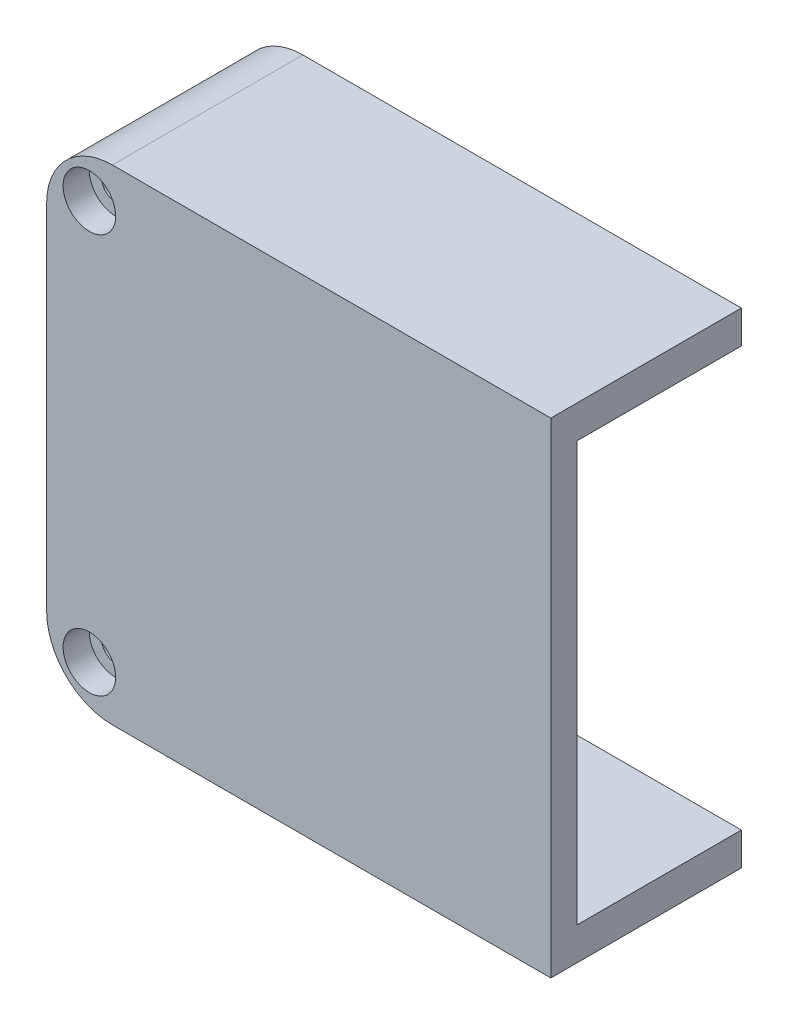
ISO-10303-21;
HEADER;
FILE_DESCRIPTION(('STEP AP214'),'2;1');
FILE_NAME('part.step','',(''),(''),'','','');
FILE_SCHEMA(('AUTOMOTIVE_DESIGN { 1 0 10303 214 1 1 1 1 }'));
ENDSEC;
DATA;
#1=APPLICATION_CONTEXT('core data for automotive mechanical design processes');
#2=APPLICATION_PROTOCOL_DEFINITION('international standard','automotive_design',2000,#1);
#3=PRODUCT_CONTEXT('',#1,'mechanical');
#4=PRODUCT('Part','Part','',(#3));
#5=PRODUCT_RELATED_PRODUCT_CATEGORY('part','',(#4));
#6=PRODUCT_DEFINITION_FORMATION('','',#4);
#7=PRODUCT_DEFINITION_CONTEXT('part definition',#1,'design');
#8=PRODUCT_DEFINITION('design','',#6,#7);
#9=PRODUCT_DEFINITION_SHAPE('','',#8);
#10=(LENGTH_UNIT() NAMED_UNIT(*) SI_UNIT(.MILLI.,.METRE.));
#11=(NAMED_UNIT(*) PLANE_ANGLE_UNIT() SI_UNIT($,.RADIAN.));
#12=(NAMED_UNIT(*) SI_UNIT($,.STERADIAN.) SOLID_ANGLE_UNIT());
#13=UNCERTAINTY_MEASURE_WITH_UNIT(LENGTH_MEASURE(1.E-05),#10,'distance_accuracy_value','');
#14=(GEOMETRIC_REPRESENTATION_CONTEXT(3) GLOBAL_UNCERTAINTY_ASSIGNED_CONTEXT((#13)) GLOBAL_UNIT_ASSIGNED_CONTEXT((#10,
#11,#12)) REPRESENTATION_CONTEXT('',''));
#15=CARTESIAN_POINT('',(0.,0.,0.));
#16=DIRECTION('',(0.,0.,1.));
#17=DIRECTION('',(1.,0.,0.));
#18=AXIS2_PLACEMENT_3D('',#15,#16,#17);
#19=CARTESIAN_POINT('',(-76.7346028544592,-29.9472521696102,25.));
#20=DIRECTION('',(-1.,0.,0.));
#21=DIRECTION('',(0.,0.,1.));
#22=AXIS2_PLACEMENT_3D('',#19,#20,#21);
#23=PLANE('',#22);
#24=DIRECTION('',(0.,1.,0.));
#25=VECTOR('',#24,1.);
#26=CARTESIAN_POINT('',(-76.7346028544592,-29.9472521696102,25.));
#27=LINE('',#26,#25);
#28=CARTESIAN_POINT('',(-76.7346028544592,-19.3909029835062,25.));
#29=VERTEX_POINT('',#28);
#30=CARTESIAN_POINT('',(-76.7346028544592,23.2934401466912,25.));
#31=VERTEX_POINT('',#30);
#32=EDGE_CURVE('E191',#29,#31,#27,.T.);
#33=ORIENTED_EDGE('',*,*,#32,.F.);
#34=DIRECTION('',(0.,0.,-1.));
#35=VECTOR('',#34,1.);
#36=CARTESIAN_POINT('',(-76.7346028544592,-19.3909029835062,0.));
#37=LINE('',#36,#35);
#38=CARTESIAN_POINT('',(-76.7346028544592,-19.3909029835062,0.));
#39=VERTEX_POINT('',#38);
#40=EDGE_CURVE('E211',#29,#39,#37,.T.);
#41=ORIENTED_EDGE('',*,*,#40,.T.);
#42=DIRECTION('',(0.,1.,0.));
#43=VECTOR('',#42,1.);
#44=CARTESIAN_POINT('',(-76.7346028544592,-29.9472521696102,0.));
#45=LINE('',#44,#43);
#46=CARTESIAN_POINT('',(-76.7346028544592,23.2934401466912,0.));
#47=VERTEX_POINT('',#46);
#48=EDGE_CURVE('E198',#39,#47,#45,.T.);
#49=ORIENTED_EDGE('',*,*,#48,.T.);
#50=DIRECTION('',(0.,0.,-1.));
#51=VECTOR('',#50,1.);
#52=CARTESIAN_POINT('',(-76.7346028544592,23.2934401466912,25.));
#53=LINE('',#52,#51);
#54=EDGE_CURVE('E209',#47,#31,#53,.F.);
#55=ORIENTED_EDGE('',*,*,#54,.T.);
#56=EDGE_LOOP('',(#33,#41,#49,#55));
#57=FACE_BOUND('',#56,.T.);
#58=ADVANCED_FACE('F33',(#57),#23,.F.);
#59=CARTESIAN_POINT('',(-76.7346028544592,-29.9472521696102,25.));
#60=DIRECTION('',(0.,-1.,0.));
#61=DIRECTION('',(0.,0.,-1.));
#62=AXIS2_PLACEMENT_3D('',#59,#60,#61);
#63=PLANE('',#62);
#64=DIRECTION('',(-1.,0.,0.));
#65=VECTOR('',#64,1.);
#66=CARTESIAN_POINT('',(-76.7346028544592,-29.9472521696102,0.));
#67=LINE('',#66,#65);
#68=CARTESIAN_POINT('',(-5.00749779782367,-29.9472521696102,0.));
#69=VERTEX_POINT('',#68);
#70=CARTESIAN_POINT('',(-66.1782536683552,-29.9472521696102,0.));
#71=VERTEX_POINT('',#70);
#72=EDGE_CURVE('E317',#69,#71,#67,.T.);
#73=ORIENTED_EDGE('',*,*,#72,.T.);
#74=DIRECTION('',(0.,0.,-1.));
#75=VECTOR('',#74,1.);
#76=CARTESIAN_POINT('',(-66.1782536683552,-29.9472521696102,25.));
#77=LINE('',#76,#75);
#78=CARTESIAN_POINT('',(-66.1782536683552,-29.9472521696102,25.));
#79=VERTEX_POINT('',#78);
#80=EDGE_CURVE('E199',#71,#79,#77,.F.);
#81=ORIENTED_EDGE('',*,*,#80,.T.);
#82=DIRECTION('',(-1.,0.,0.));
#83=VECTOR('',#82,1.);
#84=CARTESIAN_POINT('',(-76.7346028544592,-29.9472521696102,25.));
#85=LINE('',#84,#83);
#86=CARTESIAN_POINT('',(-5.00749779782367,-29.9472521696102,25.));
#87=VERTEX_POINT('',#86);
#88=EDGE_CURVE('E197',#87,#79,#85,.T.);
#89=ORIENTED_EDGE('',*,*,#88,.F.);
#90=DIRECTION('',(0.,0.,-1.));
#91=VECTOR('',#90,1.);
#92=CARTESIAN_POINT('',(-5.00749779782367,-29.9472521696102,25.));
#93=LINE('',#92,#91);
#94=EDGE_CURVE('E304',#87,#69,#93,.T.);
#95=ORIENTED_EDGE('',*,*,#94,.T.);
#96=EDGE_LOOP('',(#73,#81,#89,#95));
#97=FACE_BOUND('',#96,.T.);
#98=ADVANCED_FACE('F363',(#97),#63,.F.);
#99=CARTESIAN_POINT('',(-76.7346028544592,33.8497893327953,25.));
#100=DIRECTION('',(0.,1.,0.));
#101=DIRECTION('',(0.,0.,1.));
#102=AXIS2_PLACEMENT_3D('',#99,#100,#101);
#103=PLANE('',#102);
#104=DIRECTION('',(1.,0.,0.));
#105=VECTOR('',#104,1.);
#106=CARTESIAN_POINT('',(-76.7346028544592,33.8497893327953,25.));
#107=LINE('',#106,#105);
#108=CARTESIAN_POINT('',(-66.1782536683552,33.8497893327953,25.));
#109=VERTEX_POINT('',#108);
#110=CARTESIAN_POINT('',(-5.00749779782368,33.8497893327953,25.));
#111=VERTEX_POINT('',#110);
#112=EDGE_CURVE('E194',#109,#111,#107,.T.);
#113=ORIENTED_EDGE('',*,*,#112,.F.);
#114=DIRECTION('',(0.,0.,-1.));
#115=VECTOR('',#114,1.);
#116=CARTESIAN_POINT('',(-66.1782536683552,33.8497893327953,0.));
#117=LINE('',#116,#115);
#118=CARTESIAN_POINT('',(-66.1782536683552,33.8497893327953,0.));
#119=VERTEX_POINT('',#118);
#120=EDGE_CURVE('E214',#109,#119,#117,.T.);
#121=ORIENTED_EDGE('',*,*,#120,.T.);
#122=DIRECTION('',(1.,0.,0.));
#123=VECTOR('',#122,1.);
#124=CARTESIAN_POINT('',(-76.7346028544592,33.8497893327953,0.));
#125=LINE('',#124,#123);
#126=CARTESIAN_POINT('',(-5.00749779782367,33.8497893327953,0.));
#127=VERTEX_POINT('',#126);
#128=EDGE_CURVE('E185',#119,#127,#125,.T.);
#129=ORIENTED_EDGE('',*,*,#128,.T.);
#130=DIRECTION('',(0.,0.,-1.));
#131=VECTOR('',#130,1.);
#132=CARTESIAN_POINT('',(-5.00749779782367,33.8497893327953,25.));
#133=LINE('',#132,#131);
#134=EDGE_CURVE('E298',#111,#127,#133,.T.);
#135=ORIENTED_EDGE('',*,*,#134,.F.);
#136=EDGE_LOOP('',(#113,#121,#129,#135));
#137=FACE_BOUND('',#136,.T.);
#138=ADVANCED_FACE('F337',(#137),#103,.F.);
#139=CARTESIAN_POINT('',(-76.7346028544592,38.8497893327953,25.));
#140=DIRECTION('',(0.,1.,0.));
#141=DIRECTION('',(0.,0.,1.));
#142=AXIS2_PLACEMENT_3D('',#139,#140,#141);
#143=PLANE('',#142);
#144=DIRECTION('',(1.,0.,0.));
#145=VECTOR('',#144,1.);
#146=CARTESIAN_POINT('',(-76.7346028544592,38.8497893327953,0.));
#147=LINE('',#146,#145);
#148=CARTESIAN_POINT('',(-71.7346028544593,38.8497893327953,0.));
#149=VERTEX_POINT('',#148);
#150=CARTESIAN_POINT('',(-5.00749779782367,38.8497893327953,0.));
#151=VERTEX_POINT('',#150);
#152=EDGE_CURVE('E329',#149,#151,#147,.T.);
#153=ORIENTED_EDGE('',*,*,#152,.F.);
#154=DIRECTION('',(0.,0.,-1.));
#155=VECTOR('',#154,1.);
#156=CARTESIAN_POINT('',(-71.7346028544593,38.8497893327953,25.));
#157=LINE('',#156,#155);
#158=CARTESIAN_POINT('',(-71.7346028544593,38.8497893327953,29.));
#159=VERTEX_POINT('',#158);
#160=EDGE_CURVE('E278',#149,#159,#157,.F.);
#161=ORIENTED_EDGE('',*,*,#160,.T.);
#162=DIRECTION('',(-1.,0.,0.));
#163=VECTOR('',#162,1.);
#164=CARTESIAN_POINT('',(-81.7346028544592,38.8497893327953,29.));
#165=LINE('',#164,#163);
#166=CARTESIAN_POINT('',(-5.00749779782368,38.8497893327953,29.));
#167=VERTEX_POINT('',#166);
#168=EDGE_CURVE('E250',#167,#159,#165,.T.);
#169=ORIENTED_EDGE('',*,*,#168,.F.);
#170=DIRECTION('',(0.,0.,-1.));
#171=VECTOR('',#170,1.);
#172=CARTESIAN_POINT('',(-5.00749779782367,38.8497893327953,25.));
#173=LINE('',#172,#171);
#174=EDGE_CURVE('E311',#167,#151,#173,.T.);
#175=ORIENTED_EDGE('',*,*,#174,.T.);
#176=EDGE_LOOP('',(#153,#161,#169,#175));
#177=FACE_BOUND('',#176,.T.);
#178=ADVANCED_FACE('F349',(#177),#143,.T.);
#179=CARTESIAN_POINT('',(-81.7346028544592,-29.9472521696102,25.));
#180=DIRECTION('',(-1.,0.,0.));
#181=DIRECTION('',(0.,0.,1.));
#182=AXIS2_PLACEMENT_3D('',#179,#180,#181);
#183=PLANE('',#182);
#184=DIRECTION('',(0.,1.,0.));
#185=VECTOR('',#184,1.);
#186=CARTESIAN_POINT('',(-81.7346028544592,-29.9472521696102,0.));
#187=LINE('',#186,#185);
#188=CARTESIAN_POINT('',(-81.7346028544592,-24.9472521696102,0.));
#189=VERTEX_POINT('',#188);
#190=CARTESIAN_POINT('',(-81.7346028544592,28.8497893327953,0.));
#191=VERTEX_POINT('',#190);
#192=EDGE_CURVE('E326',#189,#191,#187,.T.);
#193=ORIENTED_EDGE('',*,*,#192,.F.);
#194=DIRECTION('',(0.,0.,-1.));
#195=VECTOR('',#194,1.);
#196=CARTESIAN_POINT('',(-81.7346028544592,-24.9472521696102,25.));
#197=LINE('',#196,#195);
#198=CARTESIAN_POINT('',(-81.7346028544592,-24.9472521696102,29.));
#199=VERTEX_POINT('',#198);
#200=EDGE_CURVE('E286',#189,#199,#197,.F.);
#201=ORIENTED_EDGE('',*,*,#200,.T.);
#202=DIRECTION('',(0.,-1.,0.));
#203=VECTOR('',#202,1.);
#204=CARTESIAN_POINT('',(-81.7346028544592,38.8497893327953,29.));
#205=LINE('',#204,#203);
#206=CARTESIAN_POINT('',(-81.7346028544592,28.8497893327953,29.));
#207=VERTEX_POINT('',#206);
#208=EDGE_CURVE('E232',#207,#199,#205,.T.);
#209=ORIENTED_EDGE('',*,*,#208,.F.);
#210=DIRECTION('',(0.,0.,-1.));
#211=VECTOR('',#210,1.);
#212=CARTESIAN_POINT('',(-81.7346028544592,28.8497893327953,25.));
#213=LINE('',#212,#211);
#214=EDGE_CURVE('E288',#207,#191,#213,.T.);
#215=ORIENTED_EDGE('',*,*,#214,.T.);
#216=EDGE_LOOP('',(#193,#201,#209,#215));
#217=FACE_BOUND('',#216,.T.);
#218=ADVANCED_FACE('F420',(#217),#183,.T.);
#219=CARTESIAN_POINT('',(-76.7346028544592,-34.9472521696102,25.));
#220=DIRECTION('',(0.,-1.,0.));
#221=DIRECTION('',(0.,0.,-1.));
#222=AXIS2_PLACEMENT_3D('',#219,#220,#221);
#223=PLANE('',#222);
#224=DIRECTION('',(1.,0.,0.));
#225=VECTOR('',#224,1.);
#226=CARTESIAN_POINT('',(-81.7346028544592,-34.9472521696102,29.));
#227=LINE('',#226,#225);
#228=CARTESIAN_POINT('',(-71.7346028544593,-34.9472521696102,29.));
#229=VERTEX_POINT('',#228);
#230=CARTESIAN_POINT('',(-5.00749779782367,-34.9472521696102,29.));
#231=VERTEX_POINT('',#230);
#232=EDGE_CURVE('E245',#229,#231,#227,.T.);
#233=ORIENTED_EDGE('',*,*,#232,.F.);
#234=DIRECTION('',(0.,0.,-1.));
#235=VECTOR('',#234,1.);
#236=CARTESIAN_POINT('',(-71.7346028544593,-34.9472521696102,25.));
#237=LINE('',#236,#235);
#238=CARTESIAN_POINT('',(-71.7346028544593,-34.9472521696102,0.));
#239=VERTEX_POINT('',#238);
#240=EDGE_CURVE('E295',#229,#239,#237,.T.);
#241=ORIENTED_EDGE('',*,*,#240,.T.);
#242=DIRECTION('',(1.,0.,0.));
#243=VECTOR('',#242,1.);
#244=CARTESIAN_POINT('',(-76.7346028544592,-34.9472521696102,0.));
#245=LINE('',#244,#243);
#246=CARTESIAN_POINT('',(-5.00749779782367,-34.9472521696102,0.));
#247=VERTEX_POINT('',#246);
#248=EDGE_CURVE('E323',#247,#239,#245,.F.);
#249=ORIENTED_EDGE('',*,*,#248,.F.);
#250=DIRECTION('',(0.,0.,-1.));
#251=VECTOR('',#250,1.);
#252=CARTESIAN_POINT('',(-5.00749779782367,-34.9472521696102,25.));
#253=LINE('',#252,#251);
#254=EDGE_CURVE('E306',#231,#247,#253,.T.);
#255=ORIENTED_EDGE('',*,*,#254,.F.);
#256=EDGE_LOOP('',(#233,#241,#249,#255));
#257=FACE_BOUND('',#256,.T.);
#258=ADVANCED_FACE('F360',(#257),#223,.T.);
#259=CARTESIAN_POINT('',(-5.00749779782367,-29.9472521696102,25.));
#260=DIRECTION('',(1.,0.,0.));
#261=DIRECTION('',(0.,0.,-1.));
#262=AXIS2_PLACEMENT_3D('',#259,#260,#261);
#263=PLANE('',#262);
#264=DIRECTION('',(0.,-1.,0.));
#265=VECTOR('',#264,1.);
#266=CARTESIAN_POINT('',(-5.00749779782367,-29.9472521696102,0.));
#267=LINE('',#266,#265);
#268=EDGE_CURVE('E320',#69,#247,#267,.T.);
#269=ORIENTED_EDGE('',*,*,#268,.F.);
#270=ORIENTED_EDGE('',*,*,#94,.F.);
#271=DIRECTION('',(0.,1.,0.));
#272=VECTOR('',#271,1.);
#273=CARTESIAN_POINT('',(-5.00749779782368,38.8497893327953,25.));
#274=LINE('',#273,#272);
#275=EDGE_CURVE('E227',#87,#111,#274,.T.);
#276=ORIENTED_EDGE('',*,*,#275,.T.);
#277=ORIENTED_EDGE('',*,*,#134,.T.);
#278=DIRECTION('',(0.,-1.,0.));
#279=VECTOR('',#278,1.);
#280=CARTESIAN_POINT('',(-5.00749779782367,38.8497893327953,0.));
#281=LINE('',#280,#279);
#282=EDGE_CURVE('E331',#151,#127,#281,.T.);
#283=ORIENTED_EDGE('',*,*,#282,.F.);
#284=ORIENTED_EDGE('',*,*,#174,.F.);
#285=DIRECTION('',(0.,1.,0.));
#286=VECTOR('',#285,1.);
#287=CARTESIAN_POINT('',(-5.00749779782368,38.8497893327953,29.));
#288=LINE('',#287,#286);
#289=EDGE_CURVE('E247',#231,#167,#288,.T.);
#290=ORIENTED_EDGE('',*,*,#289,.F.);
#291=ORIENTED_EDGE('',*,*,#254,.T.);
#292=EDGE_LOOP('',(#269,#270,#276,#277,#283,#284,#290,#291));
#293=FACE_BOUND('',#292,.T.);
#294=ADVANCED_FACE('F343',(#293),#263,.T.);
#295=CARTESIAN_POINT('',(0.,0.,0.));
#296=DIRECTION('',(0.,0.,-1.));
#297=DIRECTION('',(-1.,0.,0.));
#298=AXIS2_PLACEMENT_3D('',#295,#296,#297);
#299=PLANE('',#298);
#300=CARTESIAN_POINT('',(-75.2346028544593,32.3497893327953,0.));
#301=DIRECTION('',(0.,0.,-1.));
#302=DIRECTION('',(-1.,0.,0.));
#303=AXIS2_PLACEMENT_3D('',#300,#301,#302);
#304=CIRCLE('',#303,2.15000000000001);
#305=CARTESIAN_POINT('',(-77.3846028544592,32.3497893327953,0.));
#306=VERTEX_POINT('',#305);
#307=EDGE_CURVE('E37',#306,#306,#304,.T.);
#308=ORIENTED_EDGE('',*,*,#307,.F.);
#309=EDGE_LOOP('',(#308));
#310=FACE_BOUND('',#309,.T.);
#311=CARTESIAN_POINT('',(-75.2346028544593,-28.4472521696102,0.));
#312=DIRECTION('',(0.,0.,-1.));
#313=DIRECTION('',(-1.,0.,0.));
#314=AXIS2_PLACEMENT_3D('',#311,#312,#313);
#315=CIRCLE('',#314,2.15000000000001);
#316=CARTESIAN_POINT('',(-77.3846028544592,-28.4472521696102,0.));
#317=VERTEX_POINT('',#316);
#318=EDGE_CURVE('E225',#317,#317,#315,.T.);
#319=ORIENTED_EDGE('',*,*,#318,.F.);
#320=EDGE_LOOP('',(#319));
#321=FACE_BOUND('',#320,.T.);
#322=ORIENTED_EDGE('',*,*,#248,.T.);
#323=CARTESIAN_POINT('',(-71.7346028544593,-24.9472521696102,0.));
#324=DIRECTION('',(0.,0.,-1.));
#325=DIRECTION('',(-1.,0.,0.));
#326=AXIS2_PLACEMENT_3D('',#323,#324,#325);
#327=CIRCLE('',#326,10.);
#328=EDGE_CURVE('E291',#239,#189,#327,.T.);
#329=ORIENTED_EDGE('',*,*,#328,.T.);
#330=ORIENTED_EDGE('',*,*,#192,.T.);
#331=CARTESIAN_POINT('',(-71.7346028544593,28.8497893327953,0.));
#332=DIRECTION('',(0.,0.,-1.));
#333=DIRECTION('',(-1.,0.,0.));
#334=AXIS2_PLACEMENT_3D('',#331,#332,#333);
#335=CIRCLE('',#334,10.);
#336=EDGE_CURVE('E293',#191,#149,#335,.T.);
#337=ORIENTED_EDGE('',*,*,#336,.T.);
#338=ORIENTED_EDGE('',*,*,#152,.T.);
#339=ORIENTED_EDGE('',*,*,#282,.T.);
#340=ORIENTED_EDGE('',*,*,#128,.F.);
#341=CARTESIAN_POINT('',(-66.1782536683552,28.8497893327953,0.));
#342=DIRECTION('',(0.,0.,-1.));
#343=DIRECTION('',(-1.,0.,0.));
#344=AXIS2_PLACEMENT_3D('',#341,#342,#343);
#345=CIRCLE('',#344,5.);
#346=CARTESIAN_POINT('',(-69.7137875742879,32.385323238728,0.));
#347=VERTEX_POINT('',#346);
#348=EDGE_CURVE('E42',#119,#347,#345,.F.);
#349=ORIENTED_EDGE('',*,*,#348,.T.);
#350=DIRECTION('',(0.707106781186547,0.707106781186548,0.));
#351=VECTOR('',#350,1.);
#352=CARTESIAN_POINT('',(-68.2493214802207,33.8497893327953,0.));
#353=LINE('',#352,#351);
#354=CARTESIAN_POINT('',(-75.270136760392,26.828974052624,0.));
#355=VERTEX_POINT('',#354);
#356=EDGE_CURVE('E180',#355,#347,#353,.T.);
#357=ORIENTED_EDGE('',*,*,#356,.F.);
#358=CARTESIAN_POINT('',(-71.7346028544592,23.2934401466912,0.));
#359=DIRECTION('',(0.,0.,-1.));
#360=DIRECTION('',(-1.,0.,0.));
#361=AXIS2_PLACEMENT_3D('',#358,#359,#360);
#362=CIRCLE('',#361,5.);
#363=EDGE_CURVE('E11',#355,#47,#362,.F.);
#364=ORIENTED_EDGE('',*,*,#363,.T.);
#365=ORIENTED_EDGE('',*,*,#48,.F.);
#366=CARTESIAN_POINT('',(-71.7346028544592,-19.3909029835062,0.));
#367=DIRECTION('',(0.,0.,-1.));
#368=DIRECTION('',(-1.,0.,0.));
#369=AXIS2_PLACEMENT_3D('',#366,#367,#368);
#370=CIRCLE('',#369,5.);
#371=CARTESIAN_POINT('',(-75.270136760392,-22.9264368894389,0.));
#372=VERTEX_POINT('',#371);
#373=EDGE_CURVE('E223',#39,#372,#370,.F.);
#374=ORIENTED_EDGE('',*,*,#373,.T.);
#375=DIRECTION('',(-0.707106781186547,0.707106781186548,0.));
#376=VECTOR('',#375,1.);
#377=CARTESIAN_POINT('',(-68.2493214802207,-29.9472521696102,0.));
#378=LINE('',#377,#376);
#379=CARTESIAN_POINT('',(-69.7137875742879,-28.482786075543,0.));
#380=VERTEX_POINT('',#379);
#381=EDGE_CURVE('E253',#380,#372,#378,.T.);
#382=ORIENTED_EDGE('',*,*,#381,.F.);
#383=CARTESIAN_POINT('',(-66.1782536683552,-24.9472521696102,0.));
#384=DIRECTION('',(0.,0.,-1.));
#385=DIRECTION('',(-1.,0.,0.));
#386=AXIS2_PLACEMENT_3D('',#383,#384,#385);
#387=CIRCLE('',#386,5.);
#388=EDGE_CURVE('E221',#380,#71,#387,.F.);
#389=ORIENTED_EDGE('',*,*,#388,.T.);
#390=ORIENTED_EDGE('',*,*,#72,.F.);
#391=ORIENTED_EDGE('',*,*,#268,.T.);
#392=EDGE_LOOP('',(#322,#329,#330,#337,#338,#339,#340,#349,#357,#364,#365,#374,#382,#389,#390,#391));
#393=FACE_BOUND('',#392,.T.);
#394=ADVANCED_FACE('F344',(#310,#321,#393),#299,.T.);
#395=CARTESIAN_POINT('',(-68.2493214802207,33.8497893327953,37.));
#396=DIRECTION('',(-0.707106781186548,0.707106781186547,0.));
#397=DIRECTION('',(-0.707106781186547,-0.707106781186548,0.));
#398=AXIS2_PLACEMENT_3D('',#395,#396,#397);
#399=PLANE('',#398);
#400=ORIENTED_EDGE('',*,*,#356,.T.);
#401=DIRECTION('',(0.,0.,-1.));
#402=VECTOR('',#401,1.);
#403=CARTESIAN_POINT('',(-69.7137875742879,32.385323238728,25.));
#404=LINE('',#403,#402);
#405=CARTESIAN_POINT('',(-69.7137875742879,32.385323238728,25.));
#406=VERTEX_POINT('',#405);
#407=EDGE_CURVE('E219',#347,#406,#404,.F.);
#408=ORIENTED_EDGE('',*,*,#407,.T.);
#409=DIRECTION('',(-0.707106781186547,-0.707106781186548,0.));
#410=VECTOR('',#409,1.);
#411=CARTESIAN_POINT('',(-68.2493214802207,33.8497893327953,25.));
#412=LINE('',#411,#410);
#413=CARTESIAN_POINT('',(-71.8006430938596,30.2984677191564,25.));
#414=VERTEX_POINT('',#413);
#415=EDGE_CURVE('E182',#406,#414,#412,.T.);
#416=ORIENTED_EDGE('',*,*,#415,.T.);
#417=CARTESIAN_POINT('',(-73.1832812408203,28.9158295721956,25.));
#418=VERTEX_POINT('',#417);
#419=EDGE_CURVE('E159',#414,#418,#412,.T.);
#420=ORIENTED_EDGE('',*,*,#419,.T.);
#421=CARTESIAN_POINT('',(-75.270136760392,26.828974052624,25.));
#422=VERTEX_POINT('',#421);
#423=EDGE_CURVE('E172',#418,#422,#412,.T.);
#424=ORIENTED_EDGE('',*,*,#423,.T.);
#425=DIRECTION('',(0.,0.,-1.));
#426=VECTOR('',#425,1.);
#427=CARTESIAN_POINT('',(-75.270136760392,26.828974052624,0.));
#428=LINE('',#427,#426);
#429=EDGE_CURVE('E217',#422,#355,#428,.T.);
#430=ORIENTED_EDGE('',*,*,#429,.T.);
#431=EDGE_LOOP('',(#400,#408,#416,#420,#424,#430));
#432=FACE_BOUND('',#431,.T.);
#433=ADVANCED_FACE('F184',(#432),#399,.F.);
#434=CARTESIAN_POINT('',(-68.2493214802207,-29.9472521696102,37.));
#435=DIRECTION('',(-0.707106781186548,-0.707106781186547,0.));
#436=DIRECTION('',(0.707106781186547,-0.707106781186548,0.));
#437=AXIS2_PLACEMENT_3D('',#434,#435,#436);
#438=PLANE('',#437);
#439=DIRECTION('',(0.707106781186547,-0.707106781186548,0.));
#440=VECTOR('',#439,1.);
#441=CARTESIAN_POINT('',(-68.2493214802207,-29.9472521696102,25.));
#442=LINE('',#441,#440);
#443=CARTESIAN_POINT('',(-75.270136760392,-22.9264368894389,25.));
#444=VERTEX_POINT('',#443);
#445=CARTESIAN_POINT('',(-73.1832812408203,-25.0132924090106,25.));
#446=VERTEX_POINT('',#445);
#447=EDGE_CURVE('E258',#444,#446,#442,.T.);
#448=ORIENTED_EDGE('',*,*,#447,.T.);
#449=CARTESIAN_POINT('',(-71.8006430938596,-26.3959305559713,25.));
#450=VERTEX_POINT('',#449);
#451=EDGE_CURVE('E260',#446,#450,#442,.T.);
#452=ORIENTED_EDGE('',*,*,#451,.T.);
#453=CARTESIAN_POINT('',(-69.7137875742879,-28.482786075543,25.));
#454=VERTEX_POINT('',#453);
#455=EDGE_CURVE('E257',#450,#454,#442,.T.);
#456=ORIENTED_EDGE('',*,*,#455,.T.);
#457=DIRECTION('',(0.,0.,-1.));
#458=VECTOR('',#457,1.);
#459=CARTESIAN_POINT('',(-69.7137875742879,-28.482786075543,0.));
#460=LINE('',#459,#458);
#461=EDGE_CURVE('E268',#454,#380,#460,.T.);
#462=ORIENTED_EDGE('',*,*,#461,.T.);
#463=ORIENTED_EDGE('',*,*,#381,.T.);
#464=DIRECTION('',(0.,0.,-1.));
#465=VECTOR('',#464,1.);
#466=CARTESIAN_POINT('',(-75.270136760392,-22.9264368894389,25.));
#467=LINE('',#466,#465);
#468=EDGE_CURVE('E277',#372,#444,#467,.F.);
#469=ORIENTED_EDGE('',*,*,#468,.T.);
#470=EDGE_LOOP('',(#448,#452,#456,#462,#463,#469));
#471=FACE_BOUND('',#470,.T.);
#472=ADVANCED_FACE('F266',(#471),#438,.F.);
#473=CARTESIAN_POINT('',(0.,0.,25.));
#474=DIRECTION('',(0.,0.,1.));
#475=DIRECTION('',(1.,0.,0.));
#476=AXIS2_PLACEMENT_3D('',#473,#474,#475);
#477=PLANE('',#476);
#478=ORIENTED_EDGE('',*,*,#423,.F.);
#479=CARTESIAN_POINT('',(-75.2346028544593,32.3497893327953,25.));
#480=DIRECTION('',(0.,0.,1.));
#481=DIRECTION('',(1.,0.,0.));
#482=AXIS2_PLACEMENT_3D('',#479,#480,#481);
#483=CIRCLE('',#482,3.99999999999999);
#484=EDGE_CURVE('E161',#418,#414,#483,.T.);
#485=ORIENTED_EDGE('',*,*,#484,.T.);
#486=ORIENTED_EDGE('',*,*,#415,.F.);
#487=CARTESIAN_POINT('',(-66.1782536683552,28.8497893327953,25.));
#488=DIRECTION('',(0.,0.,1.));
#489=DIRECTION('',(1.,0.,0.));
#490=AXIS2_PLACEMENT_3D('',#487,#488,#489);
#491=CIRCLE('',#490,5.);
#492=EDGE_CURVE('E202',#406,#109,#491,.F.);
#493=ORIENTED_EDGE('',*,*,#492,.T.);
#494=ORIENTED_EDGE('',*,*,#112,.T.);
#495=ORIENTED_EDGE('',*,*,#275,.F.);
#496=ORIENTED_EDGE('',*,*,#88,.T.);
#497=CARTESIAN_POINT('',(-66.1782536683552,-24.9472521696102,25.));
#498=DIRECTION('',(0.,0.,1.));
#499=DIRECTION('',(1.,0.,0.));
#500=AXIS2_PLACEMENT_3D('',#497,#498,#499);
#501=CIRCLE('',#500,5.);
#502=EDGE_CURVE('E206',#79,#454,#501,.F.);
#503=ORIENTED_EDGE('',*,*,#502,.T.);
#504=ORIENTED_EDGE('',*,*,#455,.F.);
#505=CARTESIAN_POINT('',(-75.2346028544593,-28.4472521696102,25.));
#506=DIRECTION('',(0.,0.,1.));
#507=DIRECTION('',(1.,0.,0.));
#508=AXIS2_PLACEMENT_3D('',#505,#506,#507);
#509=CIRCLE('',#508,3.99999999999999);
#510=EDGE_CURVE('E235',#450,#446,#509,.T.);
#511=ORIENTED_EDGE('',*,*,#510,.T.);
#512=ORIENTED_EDGE('',*,*,#447,.F.);
#513=CARTESIAN_POINT('',(-71.7346028544592,-19.3909029835062,25.));
#514=DIRECTION('',(0.,0.,1.));
#515=DIRECTION('',(1.,0.,0.));
#516=AXIS2_PLACEMENT_3D('',#513,#514,#515);
#517=CIRCLE('',#516,5.);
#518=EDGE_CURVE('E204',#444,#29,#517,.F.);
#519=ORIENTED_EDGE('',*,*,#518,.T.);
#520=ORIENTED_EDGE('',*,*,#32,.T.);
#521=CARTESIAN_POINT('',(-71.7346028544592,23.2934401466912,25.));
#522=DIRECTION('',(0.,0.,1.));
#523=DIRECTION('',(1.,0.,0.));
#524=AXIS2_PLACEMENT_3D('',#521,#522,#523);
#525=CIRCLE('',#524,5.);
#526=EDGE_CURVE('E176',#31,#422,#525,.F.);
#527=ORIENTED_EDGE('',*,*,#526,.T.);
#528=EDGE_LOOP('',(#478,#485,#486,#493,#494,#495,#496,#503,#504,#511,#512,#519,#520,#527));
#529=FACE_BOUND('',#528,.T.);
#530=ADVANCED_FACE('F173',(#529),#477,.F.);
#531=CARTESIAN_POINT('',(0.,0.,29.));
#532=DIRECTION('',(0.,0.,1.));
#533=DIRECTION('',(1.,0.,0.));
#534=AXIS2_PLACEMENT_3D('',#531,#532,#533);
#535=PLANE('',#534);
#536=CARTESIAN_POINT('',(-75.2346028544593,32.3497893327953,29.));
#537=DIRECTION('',(0.,0.,1.));
#538=DIRECTION('',(1.,0.,0.));
#539=AXIS2_PLACEMENT_3D('',#536,#537,#538);
#540=CIRCLE('',#539,3.99999999999999);
#541=CARTESIAN_POINT('',(-71.2346028544593,32.3497893327953,29.));
#542=VERTEX_POINT('',#541);
#543=EDGE_CURVE('E162',#542,#542,#540,.T.);
#544=ORIENTED_EDGE('',*,*,#543,.F.);
#545=EDGE_LOOP('',(#544));
#546=FACE_BOUND('',#545,.T.);
#547=CARTESIAN_POINT('',(-75.2346028544593,-28.4472521696102,29.));
#548=DIRECTION('',(0.,0.,1.));
#549=DIRECTION('',(1.,0.,0.));
#550=AXIS2_PLACEMENT_3D('',#547,#548,#549);
#551=CIRCLE('',#550,3.99999999999999);
#552=CARTESIAN_POINT('',(-71.2346028544593,-28.4472521696102,29.));
#553=VERTEX_POINT('',#552);
#554=EDGE_CURVE('E386',#553,#553,#551,.T.);
#555=ORIENTED_EDGE('',*,*,#554,.F.);
#556=EDGE_LOOP('',(#555));
#557=FACE_BOUND('',#556,.T.);
#558=ORIENTED_EDGE('',*,*,#208,.T.);
#559=CARTESIAN_POINT('',(-71.7346028544593,-24.9472521696102,29.));
#560=DIRECTION('',(0.,0.,1.));
#561=DIRECTION('',(1.,0.,0.));
#562=AXIS2_PLACEMENT_3D('',#559,#560,#561);
#563=CIRCLE('',#562,10.);
#564=EDGE_CURVE('E282',#199,#229,#563,.T.);
#565=ORIENTED_EDGE('',*,*,#564,.T.);
#566=ORIENTED_EDGE('',*,*,#232,.T.);
#567=ORIENTED_EDGE('',*,*,#289,.T.);
#568=ORIENTED_EDGE('',*,*,#168,.T.);
#569=CARTESIAN_POINT('',(-71.7346028544593,28.8497893327953,29.));
#570=DIRECTION('',(0.,0.,1.));
#571=DIRECTION('',(1.,0.,0.));
#572=AXIS2_PLACEMENT_3D('',#569,#570,#571);
#573=CIRCLE('',#572,10.);
#574=EDGE_CURVE('E284',#159,#207,#573,.T.);
#575=ORIENTED_EDGE('',*,*,#574,.T.);
#576=EDGE_LOOP('',(#558,#565,#566,#567,#568,#575));
#577=FACE_BOUND('',#576,.T.);
#578=ADVANCED_FACE('F352',(#546,#557,#577),#535,.T.);
#579=CARTESIAN_POINT('',(-71.7346028544593,-24.9472521696102,25.));
#580=DIRECTION('',(0.,0.,-1.));
#581=DIRECTION('',(-1.,0.,0.));
#582=AXIS2_PLACEMENT_3D('',#579,#580,#581);
#583=CYLINDRICAL_SURFACE('',#582,10.);
#584=ORIENTED_EDGE('',*,*,#564,.F.);
#585=ORIENTED_EDGE('',*,*,#200,.F.);
#586=ORIENTED_EDGE('',*,*,#328,.F.);
#587=ORIENTED_EDGE('',*,*,#240,.F.);
#588=EDGE_LOOP('',(#584,#585,#586,#587));
#589=FACE_BOUND('',#588,.T.);
#590=ADVANCED_FACE('F396',(#589),#583,.T.);
#591=CARTESIAN_POINT('',(-71.7346028544593,28.8497893327953,25.));
#592=DIRECTION('',(0.,0.,-1.));
#593=DIRECTION('',(-1.,0.,0.));
#594=AXIS2_PLACEMENT_3D('',#591,#592,#593);
#595=CYLINDRICAL_SURFACE('',#594,10.);
#596=ORIENTED_EDGE('',*,*,#574,.F.);
#597=ORIENTED_EDGE('',*,*,#160,.F.);
#598=ORIENTED_EDGE('',*,*,#336,.F.);
#599=ORIENTED_EDGE('',*,*,#214,.F.);
#600=EDGE_LOOP('',(#596,#597,#598,#599));
#601=FACE_BOUND('',#600,.T.);
#602=ADVANCED_FACE('F402',(#601),#595,.T.);
#603=CARTESIAN_POINT('',(-66.1782536683552,-24.9472521696102,37.));
#604=DIRECTION('',(0.,0.,1.));
#605=DIRECTION('',(1.,0.,0.));
#606=AXIS2_PLACEMENT_3D('',#603,#604,#605);
#607=CYLINDRICAL_SURFACE('',#606,5.);
#608=ORIENTED_EDGE('',*,*,#502,.F.);
#609=ORIENTED_EDGE('',*,*,#80,.F.);
#610=ORIENTED_EDGE('',*,*,#388,.F.);
#611=ORIENTED_EDGE('',*,*,#461,.F.);
#612=EDGE_LOOP('',(#608,#609,#610,#611));
#613=FACE_BOUND('',#612,.T.);
#614=ADVANCED_FACE('F276',(#613),#607,.F.);
#615=CARTESIAN_POINT('',(-71.7346028544592,-19.3909029835062,25.));
#616=DIRECTION('',(0.,0.,1.));
#617=DIRECTION('',(1.,0.,0.));
#618=AXIS2_PLACEMENT_3D('',#615,#616,#617);
#619=CYLINDRICAL_SURFACE('',#618,5.);
#620=ORIENTED_EDGE('',*,*,#518,.F.);
#621=ORIENTED_EDGE('',*,*,#468,.F.);
#622=ORIENTED_EDGE('',*,*,#373,.F.);
#623=ORIENTED_EDGE('',*,*,#40,.F.);
#624=EDGE_LOOP('',(#620,#621,#622,#623));
#625=FACE_BOUND('',#624,.T.);
#626=ADVANCED_FACE('F377',(#625),#619,.F.);
#627=CARTESIAN_POINT('',(-66.1782536683552,28.8497893327953,25.));
#628=DIRECTION('',(0.,0.,1.));
#629=DIRECTION('',(1.,0.,0.));
#630=AXIS2_PLACEMENT_3D('',#627,#628,#629);
#631=CYLINDRICAL_SURFACE('',#630,5.);
#632=ORIENTED_EDGE('',*,*,#492,.F.);
#633=ORIENTED_EDGE('',*,*,#407,.F.);
#634=ORIENTED_EDGE('',*,*,#348,.F.);
#635=ORIENTED_EDGE('',*,*,#120,.F.);
#636=EDGE_LOOP('',(#632,#633,#634,#635));
#637=FACE_BOUND('',#636,.T.);
#638=ADVANCED_FACE('F366',(#637),#631,.F.);
#639=CARTESIAN_POINT('',(-71.7346028544592,23.2934401466912,37.));
#640=DIRECTION('',(0.,0.,1.));
#641=DIRECTION('',(1.,0.,0.));
#642=AXIS2_PLACEMENT_3D('',#639,#640,#641);
#643=CYLINDRICAL_SURFACE('',#642,5.);
#644=ORIENTED_EDGE('',*,*,#526,.F.);
#645=ORIENTED_EDGE('',*,*,#54,.F.);
#646=ORIENTED_EDGE('',*,*,#363,.F.);
#647=ORIENTED_EDGE('',*,*,#429,.F.);
#648=EDGE_LOOP('',(#644,#645,#646,#647));
#649=FACE_BOUND('',#648,.T.);
#650=ADVANCED_FACE('F35',(#649),#643,.F.);
#651=CARTESIAN_POINT('',(-73.0846028544592,-28.4472521696102,25.));
#652=DIRECTION('',(0.,0.,-1.));
#653=DIRECTION('',(-1.,0.,0.));
#654=AXIS2_PLACEMENT_3D('',#651,#652,#653);
#655=PLANE('',#654);
#656=CARTESIAN_POINT('',(-75.2346028544593,-28.4472521696102,25.));
#657=DIRECTION('',(0.,0.,1.));
#658=DIRECTION('',(1.,0.,0.));
#659=AXIS2_PLACEMENT_3D('',#656,#657,#658);
#660=CIRCLE('',#659,2.15000000000001);
#661=CARTESIAN_POINT('',(-73.0846028544592,-28.4472521696102,25.));
#662=VERTEX_POINT('',#661);
#663=EDGE_CURVE('E228',#662,#662,#660,.T.);
#664=ORIENTED_EDGE('',*,*,#663,.F.);
#665=EDGE_LOOP('',(#664));
#666=FACE_BOUND('',#665,.T.);
#667=EDGE_CURVE('E56',#446,#450,#509,.T.);
#668=ORIENTED_EDGE('',*,*,#667,.T.);
#669=ORIENTED_EDGE('',*,*,#451,.F.);
#670=EDGE_LOOP('',(#668,#669));
#671=FACE_BOUND('',#670,.T.);
#672=ADVANCED_FACE('F438',(#666,#671),#655,.F.);
#673=CARTESIAN_POINT('',(-75.2346028544593,-28.4472521696102,29.));
#674=DIRECTION('',(0.,0.,1.));
#675=DIRECTION('',(1.,0.,0.));
#676=AXIS2_PLACEMENT_3D('',#673,#674,#675);
#677=CYLINDRICAL_SURFACE('',#676,2.15000000000001);
#678=ORIENTED_EDGE('',*,*,#318,.T.);
#679=EDGE_LOOP('',(#678));
#680=FACE_BOUND('',#679,.T.);
#681=ORIENTED_EDGE('',*,*,#663,.T.);
#682=EDGE_LOOP('',(#681));
#683=FACE_BOUND('',#682,.T.);
#684=ADVANCED_FACE('F382',(#680,#683),#677,.F.);
#685=CARTESIAN_POINT('',(-75.2346028544593,-28.4472521696102,29.));
#686=DIRECTION('',(0.,0.,1.));
#687=DIRECTION('',(1.,0.,0.));
#688=AXIS2_PLACEMENT_3D('',#685,#686,#687);
#689=CYLINDRICAL_SURFACE('',#688,3.99999999999999);
#690=ORIENTED_EDGE('',*,*,#510,.F.);
#691=ORIENTED_EDGE('',*,*,#667,.F.);
#692=EDGE_LOOP('',(#690,#691));
#693=FACE_BOUND('',#692,.T.);
#694=ORIENTED_EDGE('',*,*,#554,.T.);
#695=EDGE_LOOP('',(#694));
#696=FACE_BOUND('',#695,.T.);
#697=ADVANCED_FACE('F379',(#693,#696),#689,.F.);
#698=CARTESIAN_POINT('',(-73.0846028544592,32.3497893327953,25.));
#699=DIRECTION('',(0.,0.,-1.));
#700=DIRECTION('',(-1.,0.,0.));
#701=AXIS2_PLACEMENT_3D('',#698,#699,#700);
#702=PLANE('',#701);
#703=CARTESIAN_POINT('',(-75.2346028544593,32.3497893327953,25.));
#704=DIRECTION('',(0.,0.,1.));
#705=DIRECTION('',(1.,0.,0.));
#706=AXIS2_PLACEMENT_3D('',#703,#704,#705);
#707=CIRCLE('',#706,2.15000000000001);
#708=CARTESIAN_POINT('',(-73.0846028544592,32.3497893327953,25.));
#709=VERTEX_POINT('',#708);
#710=EDGE_CURVE('E170',#709,#709,#707,.T.);
#711=ORIENTED_EDGE('',*,*,#710,.F.);
#712=EDGE_LOOP('',(#711));
#713=FACE_BOUND('',#712,.T.);
#714=EDGE_CURVE('E49',#414,#418,#483,.T.);
#715=ORIENTED_EDGE('',*,*,#714,.T.);
#716=ORIENTED_EDGE('',*,*,#419,.F.);
#717=EDGE_LOOP('',(#715,#716));
#718=FACE_BOUND('',#717,.T.);
#719=ADVANCED_FACE('F157',(#713,#718),#702,.F.);
#720=CARTESIAN_POINT('',(-75.2346028544593,32.3497893327953,29.));
#721=DIRECTION('',(0.,0.,1.));
#722=DIRECTION('',(1.,0.,0.));
#723=AXIS2_PLACEMENT_3D('',#720,#721,#722);
#724=CYLINDRICAL_SURFACE('',#723,2.15000000000001);
#725=ORIENTED_EDGE('',*,*,#307,.T.);
#726=EDGE_LOOP('',(#725));
#727=FACE_BOUND('',#726,.T.);
#728=ORIENTED_EDGE('',*,*,#710,.T.);
#729=EDGE_LOOP('',(#728));
#730=FACE_BOUND('',#729,.T.);
#731=ADVANCED_FACE('F449',(#727,#730),#724,.F.);
#732=CARTESIAN_POINT('',(-75.2346028544593,32.3497893327953,29.));
#733=DIRECTION('',(0.,0.,1.));
#734=DIRECTION('',(1.,0.,0.));
#735=AXIS2_PLACEMENT_3D('',#732,#733,#734);
#736=CYLINDRICAL_SURFACE('',#735,3.99999999999999);
#737=ORIENTED_EDGE('',*,*,#484,.F.);
#738=ORIENTED_EDGE('',*,*,#714,.F.);
#739=EDGE_LOOP('',(#737,#738));
#740=FACE_BOUND('',#739,.T.);
#741=ORIENTED_EDGE('',*,*,#543,.T.);
#742=EDGE_LOOP('',(#741));
#743=FACE_BOUND('',#742,.T.);
#744=ADVANCED_FACE('F165',(#740,#743),#736,.F.);
#745=CLOSED_SHELL('',(#58,#98,#138,#178,#218,#258,#294,#394,#433,#472,#530,#578,#590,#602,#614,
#626,#638,#650,#672,#684,#697,#719,#731,#744));
#746=MANIFOLD_SOLID_BREP('B2',#745);
#747=ADVANCED_BREP_SHAPE_REPRESENTATION('',(#18,#746),#14);
#748=SHAPE_DEFINITION_REPRESENTATION(#9,#747);
ENDSEC;
END-ISO-10303-21;
